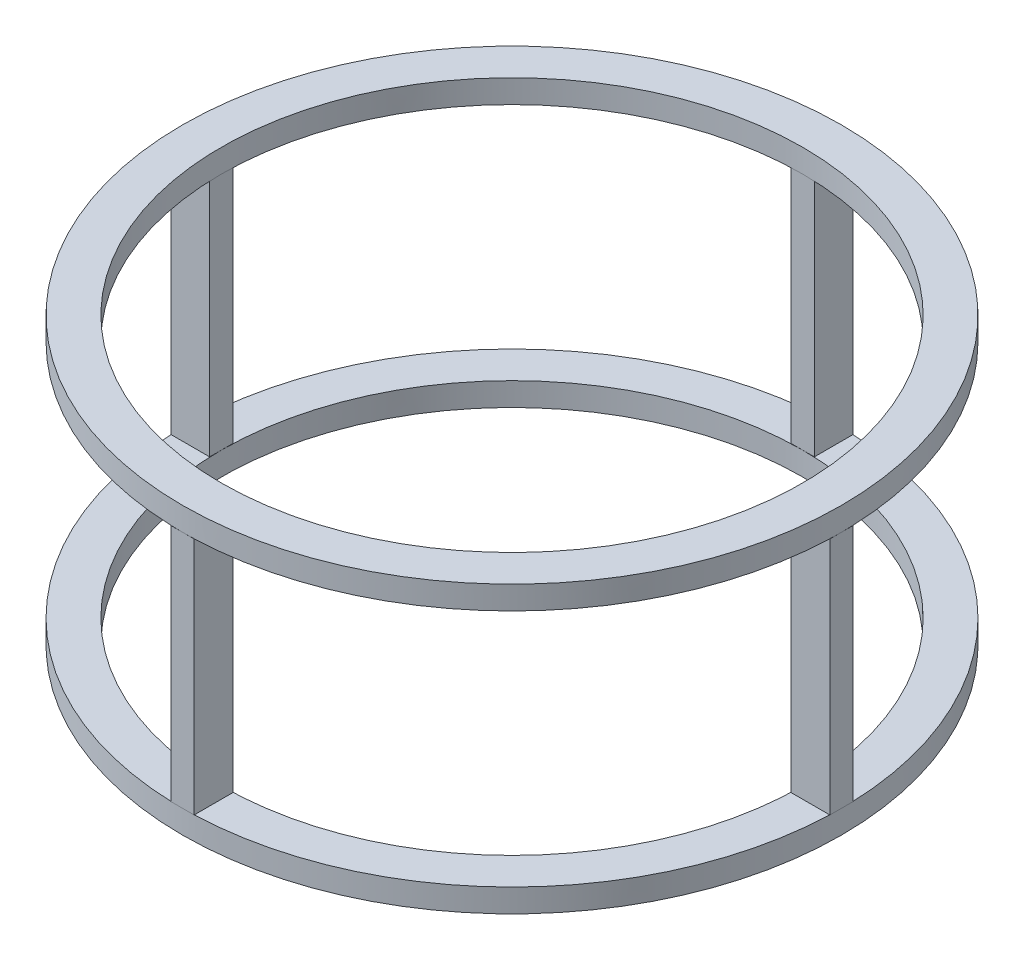
ISO-10303-21;
HEADER;
FILE_DESCRIPTION(('STEP AP214'),'2;1');
FILE_NAME('part.step','',(''),(''),'','','');
FILE_SCHEMA(('AUTOMOTIVE_DESIGN { 1 0 10303 214 1 1 1 1 }'));
ENDSEC;
DATA;
#1=APPLICATION_CONTEXT('core data for automotive mechanical design processes');
#2=APPLICATION_PROTOCOL_DEFINITION('international standard','automotive_design',2000,#1);
#3=PRODUCT_CONTEXT('',#1,'mechanical');
#4=PRODUCT('Part','Part','',(#3));
#5=PRODUCT_RELATED_PRODUCT_CATEGORY('part','',(#4));
#6=PRODUCT_DEFINITION_FORMATION('','',#4);
#7=PRODUCT_DEFINITION_CONTEXT('part definition',#1,'design');
#8=PRODUCT_DEFINITION('design','',#6,#7);
#9=PRODUCT_DEFINITION_SHAPE('','',#8);
#10=(LENGTH_UNIT() NAMED_UNIT(*) SI_UNIT(.MILLI.,.METRE.));
#11=(NAMED_UNIT(*) PLANE_ANGLE_UNIT() SI_UNIT($,.RADIAN.));
#12=(NAMED_UNIT(*) SI_UNIT($,.STERADIAN.) SOLID_ANGLE_UNIT());
#13=UNCERTAINTY_MEASURE_WITH_UNIT(LENGTH_MEASURE(1.E-05),#10,'distance_accuracy_value','');
#14=(GEOMETRIC_REPRESENTATION_CONTEXT(3) GLOBAL_UNCERTAINTY_ASSIGNED_CONTEXT((#13)) GLOBAL_UNIT_ASSIGNED_CONTEXT((#10,
#11,#12)) REPRESENTATION_CONTEXT('',''));
#15=CARTESIAN_POINT('',(0.,0.,0.));
#16=DIRECTION('',(0.,0.,1.));
#17=DIRECTION('',(1.,0.,0.));
#18=AXIS2_PLACEMENT_3D('',#15,#16,#17);
#19=CARTESIAN_POINT('',(0.,3.81,0.));
#20=DIRECTION('',(0.,1.,0.));
#21=DIRECTION('',(0.,0.,1.));
#22=AXIS2_PLACEMENT_3D('',#19,#20,#21);
#23=PLANE('',#22);
#24=CARTESIAN_POINT('',(0.,3.81,0.));
#25=DIRECTION('',(0.,1.,0.));
#26=DIRECTION('',(0.,0.,1.));
#27=AXIS2_PLACEMENT_3D('',#24,#25,#26);
#28=CIRCLE('',#27,53.975);
#29=CARTESIAN_POINT('',(1.905,3.81,53.941371877252));
#30=VERTEX_POINT('',#29);
#31=CARTESIAN_POINT('',(53.941371877252,3.81,1.90500000000056));
#32=VERTEX_POINT('',#31);
#33=EDGE_CURVE('E538',#30,#32,#28,.T.);
#34=ORIENTED_EDGE('',*,*,#33,.T.);
#35=DIRECTION('',(-1.,0.,0.));
#36=VECTOR('',#35,1.);
#37=CARTESIAN_POINT('',(53.975,3.81,1.90500000000057));
#38=LINE('',#37,#36);
#39=CARTESIAN_POINT('',(47.625,3.81,1.9050000000005));
#40=VERTEX_POINT('',#39);
#41=EDGE_CURVE('E61',#32,#40,#38,.T.);
#42=ORIENTED_EDGE('',*,*,#41,.T.);
#43=DIRECTION('',(0.,0.,-1.));
#44=VECTOR('',#43,1.);
#45=CARTESIAN_POINT('',(47.625,3.81,1.9050000000005));
#46=LINE('',#45,#44);
#47=CARTESIAN_POINT('',(47.625,3.81,4.98845396287213E-13));
#48=VERTEX_POINT('',#47);
#49=EDGE_CURVE('E318',#40,#48,#46,.T.);
#50=ORIENTED_EDGE('',*,*,#49,.T.);
#51=CARTESIAN_POINT('',(0.,3.81,0.));
#52=DIRECTION('',(0.,1.,0.));
#53=DIRECTION('',(0.,0.,1.));
#54=AXIS2_PLACEMENT_3D('',#51,#52,#53);
#55=CIRCLE('',#54,47.625);
#56=CARTESIAN_POINT('',(0.,3.81,47.625));
#57=VERTEX_POINT('',#56);
#58=EDGE_CURVE('E528',#57,#48,#55,.T.);
#59=ORIENTED_EDGE('',*,*,#58,.F.);
#60=DIRECTION('',(1.,0.,0.));
#61=VECTOR('',#60,1.);
#62=CARTESIAN_POINT('',(-1.905,3.81,47.625));
#63=LINE('',#62,#61);
#64=CARTESIAN_POINT('',(1.905,3.81,47.625));
#65=VERTEX_POINT('',#64);
#66=EDGE_CURVE('E524',#57,#65,#63,.T.);
#67=ORIENTED_EDGE('',*,*,#66,.T.);
#68=DIRECTION('',(0.,0.,-1.));
#69=VECTOR('',#68,1.);
#70=CARTESIAN_POINT('',(1.905,3.81,53.975));
#71=LINE('',#70,#69);
#72=EDGE_CURVE('E51',#30,#65,#71,.T.);
#73=ORIENTED_EDGE('',*,*,#72,.F.);
#74=EDGE_LOOP('',(#34,#42,#50,#59,#67,#73));
#75=FACE_BOUND('',#74,.T.);
#76=ADVANCED_FACE('F41',(#75),#23,.T.);
#77=CARTESIAN_POINT('',(0.,42.96918,0.));
#78=DIRECTION('',(0.,1.,0.));
#79=DIRECTION('',(0.,0.,1.));
#80=AXIS2_PLACEMENT_3D('',#77,#78,#79);
#81=PLANE('',#80);
#82=DIRECTION('',(1.,0.,0.));
#83=VECTOR('',#82,1.);
#84=CARTESIAN_POINT('',(53.975,42.96918,1.90500000000057));
#85=LINE('',#84,#83);
#86=CARTESIAN_POINT('',(47.625,42.96918,1.9050000000005));
#87=VERTEX_POINT('',#86);
#88=CARTESIAN_POINT('',(53.941371877252,42.96918,1.90500000000056));
#89=VERTEX_POINT('',#88);
#90=EDGE_CURVE('E269',#87,#89,#85,.T.);
#91=ORIENTED_EDGE('',*,*,#90,.T.);
#92=CARTESIAN_POINT('',(0.,42.96918,0.));
#93=DIRECTION('',(0.,1.,0.));
#94=DIRECTION('',(0.,0.,1.));
#95=AXIS2_PLACEMENT_3D('',#92,#93,#94);
#96=CIRCLE('',#95,53.975);
#97=CARTESIAN_POINT('',(1.905,42.96918,53.941371877252));
#98=VERTEX_POINT('',#97);
#99=EDGE_CURVE('E54',#98,#89,#96,.T.);
#100=ORIENTED_EDGE('',*,*,#99,.F.);
#101=DIRECTION('',(0.,0.,1.));
#102=VECTOR('',#101,1.);
#103=CARTESIAN_POINT('',(1.905,42.96918,53.975));
#104=LINE('',#103,#102);
#105=CARTESIAN_POINT('',(1.905,42.96918,47.625));
#106=VERTEX_POINT('',#105);
#107=EDGE_CURVE('E487',#106,#98,#104,.T.);
#108=ORIENTED_EDGE('',*,*,#107,.F.);
#109=DIRECTION('',(1.,0.,0.));
#110=VECTOR('',#109,1.);
#111=CARTESIAN_POINT('',(-1.905,42.96918,47.625));
#112=LINE('',#111,#110);
#113=CARTESIAN_POINT('',(0.,42.96918,47.625));
#114=VERTEX_POINT('',#113);
#115=EDGE_CURVE('E518',#114,#106,#112,.T.);
#116=ORIENTED_EDGE('',*,*,#115,.F.);
#117=CARTESIAN_POINT('',(0.,42.96918,0.));
#118=DIRECTION('',(0.,1.,0.));
#119=DIRECTION('',(0.,0.,1.));
#120=AXIS2_PLACEMENT_3D('',#117,#118,#119);
#121=CIRCLE('',#120,47.625);
#122=CARTESIAN_POINT('',(47.625,42.96918,4.98845396287212E-13));
#123=VERTEX_POINT('',#122);
#124=EDGE_CURVE('E461',#114,#123,#121,.T.);
#125=ORIENTED_EDGE('',*,*,#124,.T.);
#126=DIRECTION('',(0.,0.,-1.));
#127=VECTOR('',#126,1.);
#128=CARTESIAN_POINT('',(47.625,42.96918,1.9050000000005));
#129=LINE('',#128,#127);
#130=EDGE_CURVE('E314',#87,#123,#129,.T.);
#131=ORIENTED_EDGE('',*,*,#130,.F.);
#132=EDGE_LOOP('',(#91,#100,#108,#116,#125,#131));
#133=FACE_BOUND('',#132,.T.);
#134=ADVANCED_FACE('F591',(#133),#81,.F.);
#135=CARTESIAN_POINT('',(47.625,3.81,-1.9049999999995));
#136=VERTEX_POINT('',#135);
#137=EDGE_CURVE('E69',#48,#136,#46,.T.);
#138=ORIENTED_EDGE('',*,*,#137,.T.);
#139=DIRECTION('',(-1.,0.,0.));
#140=VECTOR('',#139,1.);
#141=CARTESIAN_POINT('',(53.975,3.81,-1.90499999999943));
#142=LINE('',#141,#140);
#143=CARTESIAN_POINT('',(53.9413718772521,3.81,-1.90499999999943));
#144=VERTEX_POINT('',#143);
#145=EDGE_CURVE('E278',#144,#136,#142,.T.);
#146=ORIENTED_EDGE('',*,*,#145,.F.);
#147=CARTESIAN_POINT('',(1.905,3.81,-53.941371877252));
#148=VERTEX_POINT('',#147);
#149=EDGE_CURVE('E539',#144,#148,#28,.T.);
#150=ORIENTED_EDGE('',*,*,#149,.T.);
#151=DIRECTION('',(0.,0.,1.));
#152=VECTOR('',#151,1.);
#153=CARTESIAN_POINT('',(1.905,3.81,-53.975));
#154=LINE('',#153,#152);
#155=CARTESIAN_POINT('',(1.905,3.81,-47.625));
#156=VERTEX_POINT('',#155);
#157=EDGE_CURVE('E350',#148,#156,#154,.T.);
#158=ORIENTED_EDGE('',*,*,#157,.T.);
#159=DIRECTION('',(-1.,0.,0.));
#160=VECTOR('',#159,1.);
#161=CARTESIAN_POINT('',(1.905,3.81,-47.625));
#162=LINE('',#161,#160);
#163=CARTESIAN_POINT('',(0.,3.81,-47.625));
#164=VERTEX_POINT('',#163);
#165=EDGE_CURVE('E375',#156,#164,#162,.T.);
#166=ORIENTED_EDGE('',*,*,#165,.T.);
#167=EDGE_CURVE('E532',#48,#164,#55,.T.);
#168=ORIENTED_EDGE('',*,*,#167,.F.);
#169=EDGE_LOOP('',(#138,#146,#150,#158,#166,#168));
#170=FACE_BOUND('',#169,.T.);
#171=ADVANCED_FACE('F592',(#170),#23,.T.);
#172=DIRECTION('',(1.,0.,0.));
#173=VECTOR('',#172,1.);
#174=CARTESIAN_POINT('',(53.975,42.96918,-1.90499999999943));
#175=LINE('',#174,#173);
#176=CARTESIAN_POINT('',(47.625,42.96918,-1.9049999999995));
#177=VERTEX_POINT('',#176);
#178=CARTESIAN_POINT('',(53.9413718772521,42.96918,-1.90499999999943));
#179=VERTEX_POINT('',#178);
#180=EDGE_CURVE('E291',#177,#179,#175,.T.);
#181=ORIENTED_EDGE('',*,*,#180,.F.);
#182=EDGE_CURVE('E317',#123,#177,#129,.T.);
#183=ORIENTED_EDGE('',*,*,#182,.F.);
#184=CARTESIAN_POINT('',(0.,42.96918,-47.625));
#185=VERTEX_POINT('',#184);
#186=EDGE_CURVE('E465',#123,#185,#121,.T.);
#187=ORIENTED_EDGE('',*,*,#186,.T.);
#188=DIRECTION('',(-1.,0.,0.));
#189=VECTOR('',#188,1.);
#190=CARTESIAN_POINT('',(1.905,42.96918,-47.625));
#191=LINE('',#190,#189);
#192=CARTESIAN_POINT('',(1.905,42.96918,-47.625));
#193=VERTEX_POINT('',#192);
#194=EDGE_CURVE('E370',#193,#185,#191,.T.);
#195=ORIENTED_EDGE('',*,*,#194,.F.);
#196=DIRECTION('',(0.,0.,-1.));
#197=VECTOR('',#196,1.);
#198=CARTESIAN_POINT('',(1.905,42.96918,-53.975));
#199=LINE('',#198,#197);
#200=CARTESIAN_POINT('',(1.905,42.96918,-53.941371877252));
#201=VERTEX_POINT('',#200);
#202=EDGE_CURVE('E359',#193,#201,#199,.T.);
#203=ORIENTED_EDGE('',*,*,#202,.T.);
#204=EDGE_CURVE('E474',#179,#201,#96,.T.);
#205=ORIENTED_EDGE('',*,*,#204,.F.);
#206=EDGE_LOOP('',(#181,#183,#187,#195,#203,#205));
#207=FACE_BOUND('',#206,.T.);
#208=ADVANCED_FACE('F599',(#207),#81,.F.);
#209=CARTESIAN_POINT('',(-1.905,3.81,-47.625));
#210=VERTEX_POINT('',#209);
#211=EDGE_CURVE('E379',#164,#210,#162,.T.);
#212=ORIENTED_EDGE('',*,*,#211,.T.);
#213=DIRECTION('',(0.,0.,1.));
#214=VECTOR('',#213,1.);
#215=CARTESIAN_POINT('',(-1.905,3.81,-53.975));
#216=LINE('',#215,#214);
#217=CARTESIAN_POINT('',(-1.905,3.81,-53.941371877252));
#218=VERTEX_POINT('',#217);
#219=EDGE_CURVE('E333',#218,#210,#216,.T.);
#220=ORIENTED_EDGE('',*,*,#219,.F.);
#221=CARTESIAN_POINT('',(-53.941371877252,3.81,-1.90500000000019));
#222=VERTEX_POINT('',#221);
#223=EDGE_CURVE('E549',#218,#222,#28,.T.);
#224=ORIENTED_EDGE('',*,*,#223,.T.);
#225=DIRECTION('',(1.,0.,0.));
#226=VECTOR('',#225,1.);
#227=CARTESIAN_POINT('',(-53.975,3.81,-1.90500000000019));
#228=LINE('',#227,#226);
#229=CARTESIAN_POINT('',(-47.625,3.81,-1.90500000000017));
#230=VERTEX_POINT('',#229);
#231=EDGE_CURVE('E413',#222,#230,#228,.T.);
#232=ORIENTED_EDGE('',*,*,#231,.T.);
#233=DIRECTION('',(0.,0.,1.));
#234=VECTOR('',#233,1.);
#235=CARTESIAN_POINT('',(-47.625,3.81,-1.90500000000017));
#236=LINE('',#235,#234);
#237=CARTESIAN_POINT('',(-47.625,3.81,-1.66281798762404E-13));
#238=VERTEX_POINT('',#237);
#239=EDGE_CURVE('E438',#230,#238,#236,.T.);
#240=ORIENTED_EDGE('',*,*,#239,.T.);
#241=EDGE_CURVE('E623',#164,#238,#55,.T.);
#242=ORIENTED_EDGE('',*,*,#241,.F.);
#243=EDGE_LOOP('',(#212,#220,#224,#232,#240,#242));
#244=FACE_BOUND('',#243,.T.);
#245=ADVANCED_FACE('F602',(#244),#23,.T.);
#246=DIRECTION('',(0.,0.,-1.));
#247=VECTOR('',#246,1.);
#248=CARTESIAN_POINT('',(-1.905,42.96918,-53.975));
#249=LINE('',#248,#247);
#250=CARTESIAN_POINT('',(-1.905,42.96918,-47.625));
#251=VERTEX_POINT('',#250);
#252=CARTESIAN_POINT('',(-1.905,42.96918,-53.941371877252));
#253=VERTEX_POINT('',#252);
#254=EDGE_CURVE('E343',#251,#253,#249,.T.);
#255=ORIENTED_EDGE('',*,*,#254,.F.);
#256=EDGE_CURVE('E374',#185,#251,#191,.T.);
#257=ORIENTED_EDGE('',*,*,#256,.F.);
#258=CARTESIAN_POINT('',(-47.625,42.96918,-1.66281798762404E-13));
#259=VERTEX_POINT('',#258);
#260=EDGE_CURVE('E695',#185,#259,#121,.T.);
#261=ORIENTED_EDGE('',*,*,#260,.T.);
#262=DIRECTION('',(0.,0.,1.));
#263=VECTOR('',#262,1.);
#264=CARTESIAN_POINT('',(-47.625,42.96918,-1.90500000000017));
#265=LINE('',#264,#263);
#266=CARTESIAN_POINT('',(-47.625,42.96918,-1.90500000000017));
#267=VERTEX_POINT('',#266);
#268=EDGE_CURVE('E433',#267,#259,#265,.T.);
#269=ORIENTED_EDGE('',*,*,#268,.F.);
#270=DIRECTION('',(-1.,0.,0.));
#271=VECTOR('',#270,1.);
#272=CARTESIAN_POINT('',(-53.975,42.96918,-1.90500000000019));
#273=LINE('',#272,#271);
#274=CARTESIAN_POINT('',(-53.941371877252,42.96918,-1.90500000000019));
#275=VERTEX_POINT('',#274);
#276=EDGE_CURVE('E422',#267,#275,#273,.T.);
#277=ORIENTED_EDGE('',*,*,#276,.T.);
#278=EDGE_CURVE('E691',#253,#275,#96,.T.);
#279=ORIENTED_EDGE('',*,*,#278,.F.);
#280=EDGE_LOOP('',(#255,#257,#261,#269,#277,#279));
#281=FACE_BOUND('',#280,.T.);
#282=ADVANCED_FACE('F609',(#281),#81,.F.);
#283=CARTESIAN_POINT('',(-1.905,42.96918,53.975));
#284=DIRECTION('',(0.,1.,0.));
#285=DIRECTION('',(0.,0.,1.));
#286=AXIS2_PLACEMENT_3D('',#283,#284,#285);
#287=PLANE('',#286);
#288=CARTESIAN_POINT('',(0.,42.96918,53.975));
#289=VERTEX_POINT('',#288);
#290=EDGE_CURVE('E53',#289,#98,#96,.T.);
#291=ORIENTED_EDGE('',*,*,#290,.F.);
#292=DIRECTION('',(1.,0.,0.));
#293=VECTOR('',#292,1.);
#294=CARTESIAN_POINT('',(-1.905,42.96918,53.975));
#295=LINE('',#294,#293);
#296=CARTESIAN_POINT('',(1.905,42.96918,53.975));
#297=VERTEX_POINT('',#296);
#298=EDGE_CURVE('E513',#289,#297,#295,.T.);
#299=ORIENTED_EDGE('',*,*,#298,.T.);
#300=EDGE_CURVE('E486',#98,#297,#104,.T.);
#301=ORIENTED_EDGE('',*,*,#300,.F.);
#302=EDGE_LOOP('',(#291,#299,#301));
#303=FACE_BOUND('',#302,.T.);
#304=ADVANCED_FACE('F604',(#303),#287,.T.);
#305=CARTESIAN_POINT('',(-47.625,3.81,1.90499999999983));
#306=VERTEX_POINT('',#305);
#307=EDGE_CURVE('E442',#238,#306,#236,.T.);
#308=ORIENTED_EDGE('',*,*,#307,.T.);
#309=DIRECTION('',(1.,0.,0.));
#310=VECTOR('',#309,1.);
#311=CARTESIAN_POINT('',(-53.975,3.81,1.90499999999981));
#312=LINE('',#311,#310);
#313=CARTESIAN_POINT('',(-53.9413718772521,3.81,1.90499999999981));
#314=VERTEX_POINT('',#313);
#315=EDGE_CURVE('E396',#314,#306,#312,.T.);
#316=ORIENTED_EDGE('',*,*,#315,.F.);
#317=CARTESIAN_POINT('',(-1.905,3.81,53.941371877252));
#318=VERTEX_POINT('',#317);
#319=EDGE_CURVE('E553',#314,#318,#28,.T.);
#320=ORIENTED_EDGE('',*,*,#319,.T.);
#321=DIRECTION('',(0.,0.,-1.));
#322=VECTOR('',#321,1.);
#323=CARTESIAN_POINT('',(-1.905,3.81,53.975));
#324=LINE('',#323,#322);
#325=CARTESIAN_POINT('',(-1.905,3.81,47.625));
#326=VERTEX_POINT('',#325);
#327=EDGE_CURVE('E500',#318,#326,#324,.T.);
#328=ORIENTED_EDGE('',*,*,#327,.T.);
#329=EDGE_CURVE('E519',#326,#57,#63,.T.);
#330=ORIENTED_EDGE('',*,*,#329,.T.);
#331=EDGE_CURVE('E533',#238,#57,#55,.T.);
#332=ORIENTED_EDGE('',*,*,#331,.F.);
#333=EDGE_LOOP('',(#308,#316,#320,#328,#330,#332));
#334=FACE_BOUND('',#333,.T.);
#335=ADVANCED_FACE('F571',(#334),#23,.T.);
#336=CARTESIAN_POINT('',(0.,0.,0.));
#337=DIRECTION('',(0.,1.,0.));
#338=DIRECTION('',(0.,0.,1.));
#339=AXIS2_PLACEMENT_3D('',#336,#337,#338);
#340=PLANE('',#339);
#341=CARTESIAN_POINT('',(0.,0.,0.));
#342=DIRECTION('',(0.,1.,0.));
#343=DIRECTION('',(0.,0.,1.));
#344=AXIS2_PLACEMENT_3D('',#341,#342,#343);
#345=CIRCLE('',#344,53.975);
#346=CARTESIAN_POINT('',(0.,0.,53.975));
#347=VERTEX_POINT('',#346);
#348=EDGE_CURVE('E45',#347,#347,#345,.T.);
#349=ORIENTED_EDGE('',*,*,#348,.F.);
#350=EDGE_LOOP('',(#349));
#351=FACE_BOUND('',#350,.T.);
#352=CARTESIAN_POINT('',(0.,0.,0.));
#353=DIRECTION('',(0.,1.,0.));
#354=DIRECTION('',(0.,0.,1.));
#355=AXIS2_PLACEMENT_3D('',#352,#353,#354);
#356=CIRCLE('',#355,47.625);
#357=CARTESIAN_POINT('',(0.,0.,47.625));
#358=VERTEX_POINT('',#357);
#359=EDGE_CURVE('E512',#358,#358,#356,.T.);
#360=ORIENTED_EDGE('',*,*,#359,.T.);
#361=EDGE_LOOP('',(#360));
#362=FACE_BOUND('',#361,.T.);
#363=ADVANCED_FACE('F568',(#351,#362),#340,.F.);
#364=CARTESIAN_POINT('',(0.,3.81,0.));
#365=DIRECTION('',(0.,-1.,0.));
#366=DIRECTION('',(0.,0.,-1.));
#367=AXIS2_PLACEMENT_3D('',#364,#365,#366);
#368=CYLINDRICAL_SURFACE('',#367,53.975);
#369=CARTESIAN_POINT('',(0.,3.81,53.975));
#370=VERTEX_POINT('',#369);
#371=EDGE_CURVE('E536',#370,#30,#28,.T.);
#372=ORIENTED_EDGE('',*,*,#371,.F.);
#373=EDGE_CURVE('E547',#318,#370,#28,.T.);
#374=ORIENTED_EDGE('',*,*,#373,.F.);
#375=ORIENTED_EDGE('',*,*,#319,.F.);
#376=CARTESIAN_POINT('',(0.,3.81,0.));
#377=DIRECTION('',(0.,-1.,0.));
#378=DIRECTION('',(0.,0.,-1.));
#379=AXIS2_PLACEMENT_3D('',#376,#377,#378);
#380=CIRCLE('',#379,53.975);
#381=CARTESIAN_POINT('',(-53.975,3.81,-1.88452705264058E-13));
#382=VERTEX_POINT('',#381);
#383=EDGE_CURVE('E455',#314,#382,#380,.T.);
#384=ORIENTED_EDGE('',*,*,#383,.T.);
#385=EDGE_CURVE('E451',#382,#222,#380,.T.);
#386=ORIENTED_EDGE('',*,*,#385,.T.);
#387=ORIENTED_EDGE('',*,*,#223,.F.);
#388=CARTESIAN_POINT('',(0.,3.81,0.));
#389=DIRECTION('',(0.,-1.,0.));
#390=DIRECTION('',(0.,0.,-1.));
#391=AXIS2_PLACEMENT_3D('',#388,#389,#390);
#392=CIRCLE('',#391,53.975);
#393=CARTESIAN_POINT('',(0.,3.81,-53.975));
#394=VERTEX_POINT('',#393);
#395=EDGE_CURVE('E388',#218,#394,#392,.T.);
#396=ORIENTED_EDGE('',*,*,#395,.T.);
#397=EDGE_CURVE('E391',#394,#148,#392,.T.);
#398=ORIENTED_EDGE('',*,*,#397,.T.);
#399=ORIENTED_EDGE('',*,*,#149,.F.);
#400=CARTESIAN_POINT('',(0.,3.81,0.));
#401=DIRECTION('',(0.,-1.,0.));
#402=DIRECTION('',(0.,0.,-1.));
#403=AXIS2_PLACEMENT_3D('',#400,#401,#402);
#404=CIRCLE('',#403,53.975);
#405=CARTESIAN_POINT('',(53.975,3.81,5.65358115792174E-13));
#406=VERTEX_POINT('',#405);
#407=EDGE_CURVE('E274',#144,#406,#404,.T.);
#408=ORIENTED_EDGE('',*,*,#407,.T.);
#409=EDGE_CURVE('E326',#406,#32,#404,.T.);
#410=ORIENTED_EDGE('',*,*,#409,.T.);
#411=ORIENTED_EDGE('',*,*,#33,.F.);
#412=EDGE_LOOP('',(#372,#374,#375,#384,#386,#387,#396,#398,#399,#408,#410,#411));
#413=FACE_BOUND('',#412,.T.);
#414=ORIENTED_EDGE('',*,*,#348,.T.);
#415=EDGE_LOOP('',(#414));
#416=FACE_BOUND('',#415,.T.);
#417=ADVANCED_FACE('F43',(#413,#416),#368,.T.);
#418=CARTESIAN_POINT('',(0.,3.81,0.));
#419=DIRECTION('',(0.,-1.,0.));
#420=DIRECTION('',(0.,0.,-1.));
#421=AXIS2_PLACEMENT_3D('',#418,#419,#420);
#422=CYLINDRICAL_SURFACE('',#421,47.625);
#423=ORIENTED_EDGE('',*,*,#58,.T.);
#424=ORIENTED_EDGE('',*,*,#167,.T.);
#425=ORIENTED_EDGE('',*,*,#241,.T.);
#426=ORIENTED_EDGE('',*,*,#331,.T.);
#427=EDGE_LOOP('',(#423,#424,#425,#426));
#428=FACE_BOUND('',#427,.T.);
#429=ORIENTED_EDGE('',*,*,#359,.F.);
#430=EDGE_LOOP('',(#429));
#431=FACE_BOUND('',#430,.T.);
#432=ADVANCED_FACE('F574',(#428,#431),#422,.F.);
#433=CARTESIAN_POINT('',(-1.905,3.81,53.975));
#434=DIRECTION('',(0.,-1.,0.));
#435=DIRECTION('',(0.,0.,-1.));
#436=AXIS2_PLACEMENT_3D('',#433,#434,#435);
#437=PLANE('',#436);
#438=DIRECTION('',(1.,0.,0.));
#439=VECTOR('',#438,1.);
#440=CARTESIAN_POINT('',(-1.905,3.81,53.975));
#441=LINE('',#440,#439);
#442=CARTESIAN_POINT('',(1.905,3.81,53.975));
#443=VERTEX_POINT('',#442);
#444=EDGE_CURVE('E508',#370,#443,#441,.T.);
#445=ORIENTED_EDGE('',*,*,#444,.F.);
#446=ORIENTED_EDGE('',*,*,#371,.T.);
#447=EDGE_CURVE('E478',#443,#30,#71,.T.);
#448=ORIENTED_EDGE('',*,*,#447,.F.);
#449=EDGE_LOOP('',(#445,#446,#448));
#450=FACE_BOUND('',#449,.T.);
#451=ADVANCED_FACE('F576',(#450),#437,.T.);
#452=CARTESIAN_POINT('',(-1.905,42.96918,53.975));
#453=DIRECTION('',(0.,0.,1.));
#454=DIRECTION('',(1.,0.,0.));
#455=AXIS2_PLACEMENT_3D('',#452,#453,#454);
#456=PLANE('',#455);
#457=CARTESIAN_POINT('',(-1.905,3.81,53.975));
#458=VERTEX_POINT('',#457);
#459=EDGE_CURVE('E523',#458,#370,#441,.T.);
#460=ORIENTED_EDGE('',*,*,#459,.T.);
#461=ORIENTED_EDGE('',*,*,#444,.T.);
#462=DIRECTION('',(0.,-1.,0.));
#463=VECTOR('',#462,1.);
#464=CARTESIAN_POINT('',(1.905,42.96918,53.975));
#465=LINE('',#464,#463);
#466=EDGE_CURVE('E470',#297,#443,#465,.T.);
#467=ORIENTED_EDGE('',*,*,#466,.F.);
#468=ORIENTED_EDGE('',*,*,#298,.F.);
#469=CARTESIAN_POINT('',(-1.905,42.96918,53.975));
#470=VERTEX_POINT('',#469);
#471=EDGE_CURVE('E509',#470,#289,#295,.T.);
#472=ORIENTED_EDGE('',*,*,#471,.F.);
#473=DIRECTION('',(0.,-1.,0.));
#474=VECTOR('',#473,1.);
#475=CARTESIAN_POINT('',(-1.905,42.96918,53.975));
#476=LINE('',#475,#474);
#477=EDGE_CURVE('E491',#470,#458,#476,.T.);
#478=ORIENTED_EDGE('',*,*,#477,.T.);
#479=EDGE_LOOP('',(#460,#461,#467,#468,#472,#478));
#480=FACE_BOUND('',#479,.T.);
#481=ADVANCED_FACE('F584',(#480),#456,.T.);
#482=CARTESIAN_POINT('',(-1.905,42.96918,53.941371877252));
#483=VERTEX_POINT('',#482);
#484=EDGE_CURVE('E11',#483,#289,#96,.T.);
#485=ORIENTED_EDGE('',*,*,#484,.F.);
#486=DIRECTION('',(0.,0.,1.));
#487=VECTOR('',#486,1.);
#488=CARTESIAN_POINT('',(-1.905,42.96918,53.975));
#489=LINE('',#488,#487);
#490=EDGE_CURVE('E503',#483,#470,#489,.T.);
#491=ORIENTED_EDGE('',*,*,#490,.T.);
#492=ORIENTED_EDGE('',*,*,#471,.T.);
#493=EDGE_LOOP('',(#485,#491,#492));
#494=FACE_BOUND('',#493,.T.);
#495=ADVANCED_FACE('F612',(#494),#287,.T.);
#496=CARTESIAN_POINT('',(-1.905,42.96918,47.625));
#497=DIRECTION('',(0.,0.,-1.));
#498=DIRECTION('',(0.,1.,0.));
#499=AXIS2_PLACEMENT_3D('',#496,#497,#498);
#500=PLANE('',#499);
#501=CARTESIAN_POINT('',(-1.905,42.96918,47.625));
#502=VERTEX_POINT('',#501);
#503=EDGE_CURVE('E514',#502,#114,#112,.T.);
#504=ORIENTED_EDGE('',*,*,#503,.T.);
#505=ORIENTED_EDGE('',*,*,#115,.T.);
#506=DIRECTION('',(0.,1.,0.));
#507=VECTOR('',#506,1.);
#508=CARTESIAN_POINT('',(1.905,42.96918,47.625));
#509=LINE('',#508,#507);
#510=EDGE_CURVE('E482',#65,#106,#509,.T.);
#511=ORIENTED_EDGE('',*,*,#510,.F.);
#512=ORIENTED_EDGE('',*,*,#66,.F.);
#513=ORIENTED_EDGE('',*,*,#329,.F.);
#514=DIRECTION('',(0.,1.,0.));
#515=VECTOR('',#514,1.);
#516=CARTESIAN_POINT('',(-1.905,42.96918,47.625));
#517=LINE('',#516,#515);
#518=EDGE_CURVE('E499',#326,#502,#517,.T.);
#519=ORIENTED_EDGE('',*,*,#518,.T.);
#520=EDGE_LOOP('',(#504,#505,#511,#512,#513,#519));
#521=FACE_BOUND('',#520,.T.);
#522=ADVANCED_FACE('F677',(#521),#500,.T.);
#523=EDGE_CURVE('E495',#458,#318,#324,.T.);
#524=ORIENTED_EDGE('',*,*,#523,.T.);
#525=ORIENTED_EDGE('',*,*,#373,.T.);
#526=ORIENTED_EDGE('',*,*,#459,.F.);
#527=EDGE_LOOP('',(#524,#525,#526));
#528=FACE_BOUND('',#527,.T.);
#529=ADVANCED_FACE('F586',(#528),#437,.T.);
#530=CARTESIAN_POINT('',(-1.905,0.,0.));
#531=DIRECTION('',(1.,0.,0.));
#532=DIRECTION('',(0.,0.,-1.));
#533=AXIS2_PLACEMENT_3D('',#530,#531,#532);
#534=PLANE('',#533);
#535=ORIENTED_EDGE('',*,*,#477,.F.);
#536=ORIENTED_EDGE('',*,*,#490,.F.);
#537=EDGE_CURVE('E504',#502,#483,#489,.T.);
#538=ORIENTED_EDGE('',*,*,#537,.F.);
#539=ORIENTED_EDGE('',*,*,#518,.F.);
#540=ORIENTED_EDGE('',*,*,#327,.F.);
#541=ORIENTED_EDGE('',*,*,#523,.F.);
#542=EDGE_LOOP('',(#535,#536,#538,#539,#540,#541));
#543=FACE_BOUND('',#542,.T.);
#544=ADVANCED_FACE('F769',(#543),#534,.F.);
#545=CARTESIAN_POINT('',(1.905,0.,0.));
#546=DIRECTION('',(1.,0.,0.));
#547=DIRECTION('',(0.,0.,-1.));
#548=AXIS2_PLACEMENT_3D('',#545,#546,#547);
#549=PLANE('',#548);
#550=ORIENTED_EDGE('',*,*,#466,.T.);
#551=ORIENTED_EDGE('',*,*,#447,.T.);
#552=ORIENTED_EDGE('',*,*,#72,.T.);
#553=ORIENTED_EDGE('',*,*,#510,.T.);
#554=ORIENTED_EDGE('',*,*,#107,.T.);
#555=ORIENTED_EDGE('',*,*,#300,.T.);
#556=EDGE_LOOP('',(#550,#551,#552,#553,#554,#555));
#557=FACE_BOUND('',#556,.T.);
#558=ADVANCED_FACE('F674',(#557),#549,.T.);
#559=DIRECTION('',(-1.,0.,0.));
#560=VECTOR('',#559,1.);
#561=CARTESIAN_POINT('',(-53.975,42.96918,1.90499999999981));
#562=LINE('',#561,#560);
#563=CARTESIAN_POINT('',(-47.625,42.96918,1.90499999999983));
#564=VERTEX_POINT('',#563);
#565=CARTESIAN_POINT('',(-53.9413718772521,42.96918,1.90499999999981));
#566=VERTEX_POINT('',#565);
#567=EDGE_CURVE('E406',#564,#566,#562,.T.);
#568=ORIENTED_EDGE('',*,*,#567,.F.);
#569=EDGE_CURVE('E437',#259,#564,#265,.T.);
#570=ORIENTED_EDGE('',*,*,#569,.F.);
#571=EDGE_CURVE('E466',#259,#114,#121,.T.);
#572=ORIENTED_EDGE('',*,*,#571,.T.);
#573=ORIENTED_EDGE('',*,*,#503,.F.);
#574=ORIENTED_EDGE('',*,*,#537,.T.);
#575=EDGE_CURVE('E460',#566,#483,#96,.T.);
#576=ORIENTED_EDGE('',*,*,#575,.F.);
#577=EDGE_LOOP('',(#568,#570,#572,#573,#574,#576));
#578=FACE_BOUND('',#577,.T.);
#579=ADVANCED_FACE('F600',(#578),#81,.F.);
#580=CARTESIAN_POINT('',(0.,46.77918,0.));
#581=DIRECTION('',(0.,1.,0.));
#582=DIRECTION('',(0.,0.,1.));
#583=AXIS2_PLACEMENT_3D('',#580,#581,#582);
#584=PLANE('',#583);
#585=CARTESIAN_POINT('',(0.,46.77918,0.));
#586=DIRECTION('',(0.,1.,0.));
#587=DIRECTION('',(0.,0.,1.));
#588=AXIS2_PLACEMENT_3D('',#585,#586,#587);
#589=CIRCLE('',#588,53.975);
#590=CARTESIAN_POINT('',(0.,46.77918,53.975));
#591=VERTEX_POINT('',#590);
#592=EDGE_CURVE('E467',#591,#591,#589,.T.);
#593=ORIENTED_EDGE('',*,*,#592,.T.);
#594=EDGE_LOOP('',(#593));
#595=FACE_BOUND('',#594,.T.);
#596=CARTESIAN_POINT('',(0.,46.77918,0.));
#597=DIRECTION('',(0.,1.,0.));
#598=DIRECTION('',(0.,0.,1.));
#599=AXIS2_PLACEMENT_3D('',#596,#597,#598);
#600=CIRCLE('',#599,47.625);
#601=CARTESIAN_POINT('',(0.,46.77918,47.625));
#602=VERTEX_POINT('',#601);
#603=EDGE_CURVE('E456',#602,#602,#600,.T.);
#604=ORIENTED_EDGE('',*,*,#603,.F.);
#605=EDGE_LOOP('',(#604));
#606=FACE_BOUND('',#605,.T.);
#607=ADVANCED_FACE('F979',(#595,#606),#584,.T.);
#608=CARTESIAN_POINT('',(0.,46.77918,0.));
#609=DIRECTION('',(0.,-1.,0.));
#610=DIRECTION('',(0.,0.,-1.));
#611=AXIS2_PLACEMENT_3D('',#608,#609,#610);
#612=CYLINDRICAL_SURFACE('',#611,53.975);
#613=ORIENTED_EDGE('',*,*,#592,.F.);
#614=EDGE_LOOP('',(#613));
#615=FACE_BOUND('',#614,.T.);
#616=ORIENTED_EDGE('',*,*,#290,.T.);
#617=ORIENTED_EDGE('',*,*,#99,.T.);
#618=CARTESIAN_POINT('',(0.,42.96918,0.));
#619=DIRECTION('',(0.,1.,0.));
#620=DIRECTION('',(0.,0.,1.));
#621=AXIS2_PLACEMENT_3D('',#618,#619,#620);
#622=CIRCLE('',#621,53.975);
#623=CARTESIAN_POINT('',(53.975,42.96918,5.65358115792174E-13));
#624=VERTEX_POINT('',#623);
#625=EDGE_CURVE('E325',#89,#624,#622,.T.);
#626=ORIENTED_EDGE('',*,*,#625,.T.);
#627=EDGE_CURVE('E312',#624,#179,#622,.T.);
#628=ORIENTED_EDGE('',*,*,#627,.T.);
#629=ORIENTED_EDGE('',*,*,#204,.T.);
#630=CARTESIAN_POINT('',(0.,42.96918,0.));
#631=DIRECTION('',(0.,1.,0.));
#632=DIRECTION('',(0.,0.,1.));
#633=AXIS2_PLACEMENT_3D('',#630,#631,#632);
#634=CIRCLE('',#633,53.975);
#635=CARTESIAN_POINT('',(0.,42.96918,-53.975));
#636=VERTEX_POINT('',#635);
#637=EDGE_CURVE('E387',#201,#636,#634,.T.);
#638=ORIENTED_EDGE('',*,*,#637,.T.);
#639=EDGE_CURVE('E368',#636,#253,#634,.T.);
#640=ORIENTED_EDGE('',*,*,#639,.T.);
#641=ORIENTED_EDGE('',*,*,#278,.T.);
#642=CARTESIAN_POINT('',(0.,42.96918,0.));
#643=DIRECTION('',(0.,1.,0.));
#644=DIRECTION('',(0.,0.,1.));
#645=AXIS2_PLACEMENT_3D('',#642,#643,#644);
#646=CIRCLE('',#645,53.975);
#647=CARTESIAN_POINT('',(-53.975,42.96918,-1.88452705264058E-13));
#648=VERTEX_POINT('',#647);
#649=EDGE_CURVE('E450',#275,#648,#646,.T.);
#650=ORIENTED_EDGE('',*,*,#649,.T.);
#651=EDGE_CURVE('E431',#648,#566,#646,.T.);
#652=ORIENTED_EDGE('',*,*,#651,.T.);
#653=ORIENTED_EDGE('',*,*,#575,.T.);
#654=ORIENTED_EDGE('',*,*,#484,.T.);
#655=EDGE_LOOP('',(#616,#617,#626,#628,#629,#638,#640,#641,#650,#652,#653,#654));
#656=FACE_BOUND('',#655,.T.);
#657=ADVANCED_FACE('F728',(#615,#656),#612,.T.);
#658=CARTESIAN_POINT('',(0.,46.77918,0.));
#659=DIRECTION('',(0.,-1.,0.));
#660=DIRECTION('',(0.,0.,-1.));
#661=AXIS2_PLACEMENT_3D('',#658,#659,#660);
#662=CYLINDRICAL_SURFACE('',#661,47.625);
#663=ORIENTED_EDGE('',*,*,#603,.T.);
#664=EDGE_LOOP('',(#663));
#665=FACE_BOUND('',#664,.T.);
#666=ORIENTED_EDGE('',*,*,#124,.F.);
#667=ORIENTED_EDGE('',*,*,#571,.F.);
#668=ORIENTED_EDGE('',*,*,#260,.F.);
#669=ORIENTED_EDGE('',*,*,#186,.F.);
#670=EDGE_LOOP('',(#666,#667,#668,#669));
#671=FACE_BOUND('',#670,.T.);
#672=ADVANCED_FACE('F744',(#665,#671),#662,.F.);
#673=CARTESIAN_POINT('',(-53.975,3.81,-1.90500000000019));
#674=DIRECTION('',(0.,-1.,0.));
#675=DIRECTION('',(0.,0.,-1.));
#676=AXIS2_PLACEMENT_3D('',#673,#674,#675);
#677=PLANE('',#676);
#678=ORIENTED_EDGE('',*,*,#383,.F.);
#679=CARTESIAN_POINT('',(-53.975,3.81,1.90499999999981));
#680=VERTEX_POINT('',#679);
#681=EDGE_CURVE('E397',#680,#314,#312,.T.);
#682=ORIENTED_EDGE('',*,*,#681,.F.);
#683=DIRECTION('',(0.,0.,1.));
#684=VECTOR('',#683,1.);
#685=CARTESIAN_POINT('',(-53.975,3.81,-1.90500000000019));
#686=LINE('',#685,#684);
#687=EDGE_CURVE('E426',#382,#680,#686,.T.);
#688=ORIENTED_EDGE('',*,*,#687,.F.);
#689=EDGE_LOOP('',(#678,#682,#688));
#690=FACE_BOUND('',#689,.T.);
#691=ADVANCED_FACE('F785',(#690),#677,.T.);
#692=CARTESIAN_POINT('',(-53.975,42.96918,-1.90500000000019));
#693=DIRECTION('',(0.,1.,0.));
#694=DIRECTION('',(0.,0.,1.));
#695=AXIS2_PLACEMENT_3D('',#692,#693,#694);
#696=PLANE('',#695);
#697=ORIENTED_EDGE('',*,*,#649,.F.);
#698=CARTESIAN_POINT('',(-53.975,42.96918,-1.90500000000019));
#699=VERTEX_POINT('',#698);
#700=EDGE_CURVE('E421',#275,#699,#273,.T.);
#701=ORIENTED_EDGE('',*,*,#700,.T.);
#702=DIRECTION('',(0.,0.,1.));
#703=VECTOR('',#702,1.);
#704=CARTESIAN_POINT('',(-53.975,42.96918,-1.90500000000019));
#705=LINE('',#704,#703);
#706=EDGE_CURVE('E427',#699,#648,#705,.T.);
#707=ORIENTED_EDGE('',*,*,#706,.T.);
#708=EDGE_LOOP('',(#697,#701,#707));
#709=FACE_BOUND('',#708,.T.);
#710=ADVANCED_FACE('F801',(#709),#696,.T.);
#711=CARTESIAN_POINT('',(-53.975,42.96918,-1.90500000000019));
#712=DIRECTION('',(-1.,0.,0.));
#713=DIRECTION('',(0.,0.,1.));
#714=AXIS2_PLACEMENT_3D('',#711,#712,#713);
#715=PLANE('',#714);
#716=CARTESIAN_POINT('',(-53.975,3.81,-1.90500000000019));
#717=VERTEX_POINT('',#716);
#718=EDGE_CURVE('E443',#717,#382,#686,.T.);
#719=ORIENTED_EDGE('',*,*,#718,.T.);
#720=ORIENTED_EDGE('',*,*,#687,.T.);
#721=DIRECTION('',(0.,-1.,0.));
#722=VECTOR('',#721,1.);
#723=CARTESIAN_POINT('',(-53.975,42.96918,1.90499999999981));
#724=LINE('',#723,#722);
#725=CARTESIAN_POINT('',(-53.975,42.96918,1.90499999999981));
#726=VERTEX_POINT('',#725);
#727=EDGE_CURVE('E392',#726,#680,#724,.T.);
#728=ORIENTED_EDGE('',*,*,#727,.F.);
#729=EDGE_CURVE('E432',#648,#726,#705,.T.);
#730=ORIENTED_EDGE('',*,*,#729,.F.);
#731=ORIENTED_EDGE('',*,*,#706,.F.);
#732=DIRECTION('',(0.,-1.,0.));
#733=VECTOR('',#732,1.);
#734=CARTESIAN_POINT('',(-53.975,42.96918,-1.90500000000019));
#735=LINE('',#734,#733);
#736=EDGE_CURVE('E409',#699,#717,#735,.T.);
#737=ORIENTED_EDGE('',*,*,#736,.T.);
#738=EDGE_LOOP('',(#719,#720,#728,#730,#731,#737));
#739=FACE_BOUND('',#738,.T.);
#740=ADVANCED_FACE('F788',(#739),#715,.T.);
#741=ORIENTED_EDGE('',*,*,#651,.F.);
#742=ORIENTED_EDGE('',*,*,#729,.T.);
#743=EDGE_CURVE('E405',#566,#726,#562,.T.);
#744=ORIENTED_EDGE('',*,*,#743,.F.);
#745=EDGE_LOOP('',(#741,#742,#744));
#746=FACE_BOUND('',#745,.T.);
#747=ADVANCED_FACE('F804',(#746),#696,.T.);
#748=CARTESIAN_POINT('',(-47.625,42.96918,-1.90500000000017));
#749=DIRECTION('',(1.,0.,0.));
#750=DIRECTION('',(0.,0.,-1.));
#751=AXIS2_PLACEMENT_3D('',#748,#749,#750);
#752=PLANE('',#751);
#753=ORIENTED_EDGE('',*,*,#268,.T.);
#754=ORIENTED_EDGE('',*,*,#569,.T.);
#755=DIRECTION('',(0.,1.,0.));
#756=VECTOR('',#755,1.);
#757=CARTESIAN_POINT('',(-47.625,42.96918,1.90499999999983));
#758=LINE('',#757,#756);
#759=EDGE_CURVE('E401',#306,#564,#758,.T.);
#760=ORIENTED_EDGE('',*,*,#759,.F.);
#761=ORIENTED_EDGE('',*,*,#307,.F.);
#762=ORIENTED_EDGE('',*,*,#239,.F.);
#763=DIRECTION('',(0.,1.,0.));
#764=VECTOR('',#763,1.);
#765=CARTESIAN_POINT('',(-47.625,42.96918,-1.90500000000017));
#766=LINE('',#765,#764);
#767=EDGE_CURVE('E418',#230,#267,#766,.T.);
#768=ORIENTED_EDGE('',*,*,#767,.T.);
#769=EDGE_LOOP('',(#753,#754,#760,#761,#762,#768));
#770=FACE_BOUND('',#769,.T.);
#771=ADVANCED_FACE('F776',(#770),#752,.T.);
#772=ORIENTED_EDGE('',*,*,#385,.F.);
#773=ORIENTED_EDGE('',*,*,#718,.F.);
#774=EDGE_CURVE('E414',#717,#222,#228,.T.);
#775=ORIENTED_EDGE('',*,*,#774,.T.);
#776=EDGE_LOOP('',(#772,#773,#775));
#777=FACE_BOUND('',#776,.T.);
#778=ADVANCED_FACE('F793',(#777),#677,.T.);
#779=CARTESIAN_POINT('',(0.,0.,-1.905));
#780=DIRECTION('',(0.,0.,1.));
#781=DIRECTION('',(1.,0.,0.));
#782=AXIS2_PLACEMENT_3D('',#779,#780,#781);
#783=PLANE('',#782);
#784=ORIENTED_EDGE('',*,*,#736,.F.);
#785=ORIENTED_EDGE('',*,*,#700,.F.);
#786=ORIENTED_EDGE('',*,*,#276,.F.);
#787=ORIENTED_EDGE('',*,*,#767,.F.);
#788=ORIENTED_EDGE('',*,*,#231,.F.);
#789=ORIENTED_EDGE('',*,*,#774,.F.);
#790=EDGE_LOOP('',(#784,#785,#786,#787,#788,#789));
#791=FACE_BOUND('',#790,.T.);
#792=ADVANCED_FACE('F796',(#791),#783,.F.);
#793=CARTESIAN_POINT('',(0.,0.,1.905));
#794=DIRECTION('',(0.,0.,1.));
#795=DIRECTION('',(1.,0.,0.));
#796=AXIS2_PLACEMENT_3D('',#793,#794,#795);
#797=PLANE('',#796);
#798=ORIENTED_EDGE('',*,*,#727,.T.);
#799=ORIENTED_EDGE('',*,*,#681,.T.);
#800=ORIENTED_EDGE('',*,*,#315,.T.);
#801=ORIENTED_EDGE('',*,*,#759,.T.);
#802=ORIENTED_EDGE('',*,*,#567,.T.);
#803=ORIENTED_EDGE('',*,*,#743,.T.);
#804=EDGE_LOOP('',(#798,#799,#800,#801,#802,#803));
#805=FACE_BOUND('',#804,.T.);
#806=ADVANCED_FACE('F778',(#805),#797,.T.);
#807=CARTESIAN_POINT('',(1.905,3.81,-53.975));
#808=DIRECTION('',(0.,-1.,0.));
#809=DIRECTION('',(0.,0.,-1.));
#810=AXIS2_PLACEMENT_3D('',#807,#808,#809);
#811=PLANE('',#810);
#812=ORIENTED_EDGE('',*,*,#397,.F.);
#813=DIRECTION('',(-1.,0.,0.));
#814=VECTOR('',#813,1.);
#815=CARTESIAN_POINT('',(1.905,3.81,-53.975));
#816=LINE('',#815,#814);
#817=CARTESIAN_POINT('',(1.905,3.81,-53.975));
#818=VERTEX_POINT('',#817);
#819=EDGE_CURVE('E380',#818,#394,#816,.T.);
#820=ORIENTED_EDGE('',*,*,#819,.F.);
#821=EDGE_CURVE('E351',#818,#148,#154,.T.);
#822=ORIENTED_EDGE('',*,*,#821,.T.);
#823=EDGE_LOOP('',(#812,#820,#822));
#824=FACE_BOUND('',#823,.T.);
#825=ADVANCED_FACE('F832',(#824),#811,.T.);
#826=CARTESIAN_POINT('',(1.905,42.96918,-53.975));
#827=DIRECTION('',(0.,1.,0.));
#828=DIRECTION('',(0.,0.,1.));
#829=AXIS2_PLACEMENT_3D('',#826,#827,#828);
#830=PLANE('',#829);
#831=ORIENTED_EDGE('',*,*,#637,.F.);
#832=CARTESIAN_POINT('',(1.905,42.96918,-53.975));
#833=VERTEX_POINT('',#832);
#834=EDGE_CURVE('E358',#201,#833,#199,.T.);
#835=ORIENTED_EDGE('',*,*,#834,.T.);
#836=DIRECTION('',(-1.,0.,0.));
#837=VECTOR('',#836,1.);
#838=CARTESIAN_POINT('',(1.905,42.96918,-53.975));
#839=LINE('',#838,#837);
#840=EDGE_CURVE('E364',#833,#636,#839,.T.);
#841=ORIENTED_EDGE('',*,*,#840,.T.);
#842=EDGE_LOOP('',(#831,#835,#841));
#843=FACE_BOUND('',#842,.T.);
#844=ADVANCED_FACE('F733',(#843),#830,.T.);
#845=CARTESIAN_POINT('',(1.905,42.96918,-53.975));
#846=DIRECTION('',(0.,0.,-1.));
#847=DIRECTION('',(-1.,0.,0.));
#848=AXIS2_PLACEMENT_3D('',#845,#846,#847);
#849=PLANE('',#848);
#850=ORIENTED_EDGE('',*,*,#819,.T.);
#851=CARTESIAN_POINT('',(-1.905,3.81,-53.975));
#852=VERTEX_POINT('',#851);
#853=EDGE_CURVE('E363',#394,#852,#816,.T.);
#854=ORIENTED_EDGE('',*,*,#853,.T.);
#855=DIRECTION('',(0.,-1.,0.));
#856=VECTOR('',#855,1.);
#857=CARTESIAN_POINT('',(-1.905,42.96918,-53.975));
#858=LINE('',#857,#856);
#859=CARTESIAN_POINT('',(-1.905,42.96918,-53.975));
#860=VERTEX_POINT('',#859);
#861=EDGE_CURVE('E329',#860,#852,#858,.T.);
#862=ORIENTED_EDGE('',*,*,#861,.F.);
#863=EDGE_CURVE('E369',#636,#860,#839,.T.);
#864=ORIENTED_EDGE('',*,*,#863,.F.);
#865=ORIENTED_EDGE('',*,*,#840,.F.);
#866=DIRECTION('',(0.,-1.,0.));
#867=VECTOR('',#866,1.);
#868=CARTESIAN_POINT('',(1.905,42.96918,-53.975));
#869=LINE('',#868,#867);
#870=EDGE_CURVE('E346',#833,#818,#869,.T.);
#871=ORIENTED_EDGE('',*,*,#870,.T.);
#872=EDGE_LOOP('',(#850,#854,#862,#864,#865,#871));
#873=FACE_BOUND('',#872,.T.);
#874=ADVANCED_FACE('F722',(#873),#849,.T.);
#875=ORIENTED_EDGE('',*,*,#639,.F.);
#876=ORIENTED_EDGE('',*,*,#863,.T.);
#877=EDGE_CURVE('E342',#253,#860,#249,.T.);
#878=ORIENTED_EDGE('',*,*,#877,.F.);
#879=EDGE_LOOP('',(#875,#876,#878));
#880=FACE_BOUND('',#879,.T.);
#881=ADVANCED_FACE('F718',(#880),#830,.T.);
#882=CARTESIAN_POINT('',(1.905,42.96918,-47.625));
#883=DIRECTION('',(0.,0.,1.));
#884=DIRECTION('',(0.,-1.,0.));
#885=AXIS2_PLACEMENT_3D('',#882,#883,#884);
#886=PLANE('',#885);
#887=ORIENTED_EDGE('',*,*,#194,.T.);
#888=ORIENTED_EDGE('',*,*,#256,.T.);
#889=DIRECTION('',(0.,1.,0.));
#890=VECTOR('',#889,1.);
#891=CARTESIAN_POINT('',(-1.905,42.96918,-47.625));
#892=LINE('',#891,#890);
#893=EDGE_CURVE('E338',#210,#251,#892,.T.);
#894=ORIENTED_EDGE('',*,*,#893,.F.);
#895=ORIENTED_EDGE('',*,*,#211,.F.);
#896=ORIENTED_EDGE('',*,*,#165,.F.);
#897=DIRECTION('',(0.,1.,0.));
#898=VECTOR('',#897,1.);
#899=CARTESIAN_POINT('',(1.905,42.96918,-47.625));
#900=LINE('',#899,#898);
#901=EDGE_CURVE('E355',#156,#193,#900,.T.);
#902=ORIENTED_EDGE('',*,*,#901,.T.);
#903=EDGE_LOOP('',(#887,#888,#894,#895,#896,#902));
#904=FACE_BOUND('',#903,.T.);
#905=ADVANCED_FACE('F633',(#904),#886,.T.);
#906=ORIENTED_EDGE('',*,*,#395,.F.);
#907=EDGE_CURVE('E334',#852,#218,#216,.T.);
#908=ORIENTED_EDGE('',*,*,#907,.F.);
#909=ORIENTED_EDGE('',*,*,#853,.F.);
#910=EDGE_LOOP('',(#906,#908,#909));
#911=FACE_BOUND('',#910,.T.);
#912=ADVANCED_FACE('F837',(#911),#811,.T.);
#913=CARTESIAN_POINT('',(1.905,0.,0.));
#914=DIRECTION('',(-1.,0.,0.));
#915=DIRECTION('',(0.,0.,1.));
#916=AXIS2_PLACEMENT_3D('',#913,#914,#915);
#917=PLANE('',#916);
#918=ORIENTED_EDGE('',*,*,#870,.F.);
#919=ORIENTED_EDGE('',*,*,#834,.F.);
#920=ORIENTED_EDGE('',*,*,#202,.F.);
#921=ORIENTED_EDGE('',*,*,#901,.F.);
#922=ORIENTED_EDGE('',*,*,#157,.F.);
#923=ORIENTED_EDGE('',*,*,#821,.F.);
#924=EDGE_LOOP('',(#918,#919,#920,#921,#922,#923));
#925=FACE_BOUND('',#924,.T.);
#926=ADVANCED_FACE('F737',(#925),#917,.F.);
#927=CARTESIAN_POINT('',(-1.905,0.,0.));
#928=DIRECTION('',(-1.,0.,0.));
#929=DIRECTION('',(0.,0.,1.));
#930=AXIS2_PLACEMENT_3D('',#927,#928,#929);
#931=PLANE('',#930);
#932=ORIENTED_EDGE('',*,*,#861,.T.);
#933=ORIENTED_EDGE('',*,*,#907,.T.);
#934=ORIENTED_EDGE('',*,*,#219,.T.);
#935=ORIENTED_EDGE('',*,*,#893,.T.);
#936=ORIENTED_EDGE('',*,*,#254,.T.);
#937=ORIENTED_EDGE('',*,*,#877,.T.);
#938=EDGE_LOOP('',(#932,#933,#934,#935,#936,#937));
#939=FACE_BOUND('',#938,.T.);
#940=ADVANCED_FACE('F629',(#939),#931,.T.);
#941=CARTESIAN_POINT('',(53.975,3.81,1.90500000000057));
#942=DIRECTION('',(0.,-1.,0.));
#943=DIRECTION('',(0.,0.,-1.));
#944=AXIS2_PLACEMENT_3D('',#941,#942,#943);
#945=PLANE('',#944);
#946=ORIENTED_EDGE('',*,*,#407,.F.);
#947=CARTESIAN_POINT('',(53.975,3.81,-1.90499999999943));
#948=VERTEX_POINT('',#947);
#949=EDGE_CURVE('E272',#948,#144,#142,.T.);
#950=ORIENTED_EDGE('',*,*,#949,.F.);
#951=DIRECTION('',(0.,0.,-1.));
#952=VECTOR('',#951,1.);
#953=CARTESIAN_POINT('',(53.975,3.81,1.90500000000057));
#954=LINE('',#953,#952);
#955=EDGE_CURVE('E258',#406,#948,#954,.T.);
#956=ORIENTED_EDGE('',*,*,#955,.F.);
#957=EDGE_LOOP('',(#946,#950,#956));
#958=FACE_BOUND('',#957,.T.);
#959=ADVANCED_FACE('F273',(#958),#945,.T.);
#960=CARTESIAN_POINT('',(53.975,42.96918,1.90500000000057));
#961=DIRECTION('',(0.,1.,0.));
#962=DIRECTION('',(0.,0.,1.));
#963=AXIS2_PLACEMENT_3D('',#960,#961,#962);
#964=PLANE('',#963);
#965=ORIENTED_EDGE('',*,*,#625,.F.);
#966=CARTESIAN_POINT('',(53.975,42.96918,1.90500000000057));
#967=VERTEX_POINT('',#966);
#968=EDGE_CURVE('E304',#89,#967,#85,.T.);
#969=ORIENTED_EDGE('',*,*,#968,.T.);
#970=DIRECTION('',(0.,0.,-1.));
#971=VECTOR('',#970,1.);
#972=CARTESIAN_POINT('',(53.975,42.96918,1.90500000000057));
#973=LINE('',#972,#971);
#974=EDGE_CURVE('E308',#967,#624,#973,.T.);
#975=ORIENTED_EDGE('',*,*,#974,.T.);
#976=EDGE_LOOP('',(#965,#969,#975));
#977=FACE_BOUND('',#976,.T.);
#978=ADVANCED_FACE('F655',(#977),#964,.T.);
#979=CARTESIAN_POINT('',(53.975,42.96918,1.90500000000057));
#980=DIRECTION('',(1.,0.,0.));
#981=DIRECTION('',(0.,0.,-1.));
#982=AXIS2_PLACEMENT_3D('',#979,#980,#981);
#983=PLANE('',#982);
#984=CARTESIAN_POINT('',(53.975,3.81,1.90500000000057));
#985=VERTEX_POINT('',#984);
#986=EDGE_CURVE('E265',#985,#406,#954,.T.);
#987=ORIENTED_EDGE('',*,*,#986,.T.);
#988=ORIENTED_EDGE('',*,*,#955,.T.);
#989=DIRECTION('',(0.,-1.,0.));
#990=VECTOR('',#989,1.);
#991=CARTESIAN_POINT('',(53.975,42.96918,-1.90499999999943));
#992=LINE('',#991,#990);
#993=CARTESIAN_POINT('',(53.975,42.96918,-1.90499999999943));
#994=VERTEX_POINT('',#993);
#995=EDGE_CURVE('E263',#994,#948,#992,.T.);
#996=ORIENTED_EDGE('',*,*,#995,.F.);
#997=EDGE_CURVE('E313',#624,#994,#973,.T.);
#998=ORIENTED_EDGE('',*,*,#997,.F.);
#999=ORIENTED_EDGE('',*,*,#974,.F.);
#1000=DIRECTION('',(0.,-1.,0.));
#1001=VECTOR('',#1000,1.);
#1002=CARTESIAN_POINT('',(53.975,42.96918,1.90500000000057));
#1003=LINE('',#1002,#1001);
#1004=EDGE_CURVE('E294',#967,#985,#1003,.T.);
#1005=ORIENTED_EDGE('',*,*,#1004,.T.);
#1006=EDGE_LOOP('',(#987,#988,#996,#998,#999,#1005));
#1007=FACE_BOUND('',#1006,.T.);
#1008=ADVANCED_FACE('F260',(#1007),#983,.T.);
#1009=ORIENTED_EDGE('',*,*,#627,.F.);
#1010=ORIENTED_EDGE('',*,*,#997,.T.);
#1011=EDGE_CURVE('E282',#179,#994,#175,.T.);
#1012=ORIENTED_EDGE('',*,*,#1011,.F.);
#1013=EDGE_LOOP('',(#1009,#1010,#1012));
#1014=FACE_BOUND('',#1013,.T.);
#1015=ADVANCED_FACE('F851',(#1014),#964,.T.);
#1016=CARTESIAN_POINT('',(47.625,42.96918,1.9050000000005));
#1017=DIRECTION('',(-1.,0.,0.));
#1018=DIRECTION('',(0.,0.,1.));
#1019=AXIS2_PLACEMENT_3D('',#1016,#1017,#1018);
#1020=PLANE('',#1019);
#1021=ORIENTED_EDGE('',*,*,#130,.T.);
#1022=ORIENTED_EDGE('',*,*,#182,.T.);
#1023=DIRECTION('',(0.,1.,0.));
#1024=VECTOR('',#1023,1.);
#1025=CARTESIAN_POINT('',(47.625,42.96918,-1.9049999999995));
#1026=LINE('',#1025,#1024);
#1027=EDGE_CURVE('E277',#136,#177,#1026,.T.);
#1028=ORIENTED_EDGE('',*,*,#1027,.F.);
#1029=ORIENTED_EDGE('',*,*,#137,.F.);
#1030=ORIENTED_EDGE('',*,*,#49,.F.);
#1031=DIRECTION('',(0.,1.,0.));
#1032=VECTOR('',#1031,1.);
#1033=CARTESIAN_POINT('',(47.625,42.96918,1.9050000000005));
#1034=LINE('',#1033,#1032);
#1035=EDGE_CURVE('E301',#40,#87,#1034,.T.);
#1036=ORIENTED_EDGE('',*,*,#1035,.T.);
#1037=EDGE_LOOP('',(#1021,#1022,#1028,#1029,#1030,#1036));
#1038=FACE_BOUND('',#1037,.T.);
#1039=ADVANCED_FACE('F749',(#1038),#1020,.T.);
#1040=ORIENTED_EDGE('',*,*,#409,.F.);
#1041=ORIENTED_EDGE('',*,*,#986,.F.);
#1042=EDGE_CURVE('E297',#985,#32,#38,.T.);
#1043=ORIENTED_EDGE('',*,*,#1042,.T.);
#1044=EDGE_LOOP('',(#1040,#1041,#1043));
#1045=FACE_BOUND('',#1044,.T.);
#1046=ADVANCED_FACE('F664',(#1045),#945,.T.);
#1047=CARTESIAN_POINT('',(0.,0.,1.905));
#1048=DIRECTION('',(0.,0.,-1.));
#1049=DIRECTION('',(-1.,0.,0.));
#1050=AXIS2_PLACEMENT_3D('',#1047,#1048,#1049);
#1051=PLANE('',#1050);
#1052=ORIENTED_EDGE('',*,*,#1004,.F.);
#1053=ORIENTED_EDGE('',*,*,#968,.F.);
#1054=ORIENTED_EDGE('',*,*,#90,.F.);
#1055=ORIENTED_EDGE('',*,*,#1035,.F.);
#1056=ORIENTED_EDGE('',*,*,#41,.F.);
#1057=ORIENTED_EDGE('',*,*,#1042,.F.);
#1058=EDGE_LOOP('',(#1052,#1053,#1054,#1055,#1056,#1057));
#1059=FACE_BOUND('',#1058,.T.);
#1060=ADVANCED_FACE('F660',(#1059),#1051,.F.);
#1061=CARTESIAN_POINT('',(0.,0.,-1.905));
#1062=DIRECTION('',(0.,0.,-1.));
#1063=DIRECTION('',(-1.,0.,0.));
#1064=AXIS2_PLACEMENT_3D('',#1061,#1062,#1063);
#1065=PLANE('',#1064);
#1066=ORIENTED_EDGE('',*,*,#995,.T.);
#1067=ORIENTED_EDGE('',*,*,#949,.T.);
#1068=ORIENTED_EDGE('',*,*,#145,.T.);
#1069=ORIENTED_EDGE('',*,*,#1027,.T.);
#1070=ORIENTED_EDGE('',*,*,#180,.T.);
#1071=ORIENTED_EDGE('',*,*,#1011,.T.);
#1072=EDGE_LOOP('',(#1066,#1067,#1068,#1069,#1070,#1071));
#1073=FACE_BOUND('',#1072,.T.);
#1074=ADVANCED_FACE('F280',(#1073),#1065,.T.);
#1075=CLOSED_SHELL('',(#76,#134,#171,#208,#245,#282,#304,#335,#363,#417,#432,#451,#481,#495,
#522,#529,#544,#558,#579,#607,#657,#672,#691,#710,#740,#747,#771,#778,#792,#806,#825,#844,#874,
#881,#905,#912,#926,#940,#959,#978,#1008,#1015,#1039,#1046,#1060,#1074));
#1076=MANIFOLD_SOLID_BREP('B2',#1075);
#1077=ADVANCED_BREP_SHAPE_REPRESENTATION('',(#18,#1076),#14);
#1078=SHAPE_DEFINITION_REPRESENTATION(#9,#1077);
ENDSEC;
END-ISO-10303-21;
